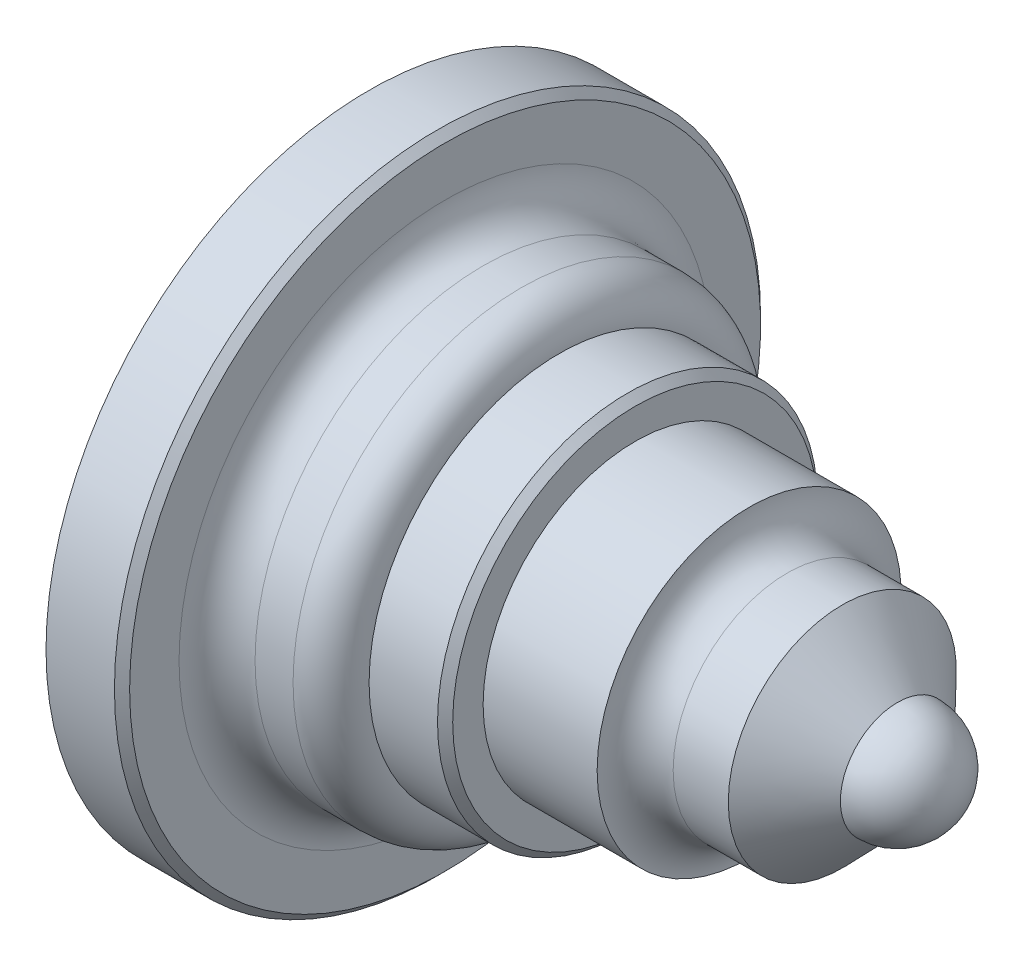
ISO-10303-21;
HEADER;
FILE_DESCRIPTION(('STEP AP214'),'2;1');
FILE_NAME('part.step','',(''),(''),'','','');
FILE_SCHEMA(('AUTOMOTIVE_DESIGN { 1 0 10303 214 1 1 1 1 }'));
ENDSEC;
DATA;
#1=APPLICATION_CONTEXT('core data for automotive mechanical design processes');
#2=APPLICATION_PROTOCOL_DEFINITION('international standard','automotive_design',2000,#1);
#3=PRODUCT_CONTEXT('',#1,'mechanical');
#4=PRODUCT('Part','Part','',(#3));
#5=PRODUCT_RELATED_PRODUCT_CATEGORY('part','',(#4));
#6=PRODUCT_DEFINITION_FORMATION('','',#4);
#7=PRODUCT_DEFINITION_CONTEXT('part definition',#1,'design');
#8=PRODUCT_DEFINITION('design','',#6,#7);
#9=PRODUCT_DEFINITION_SHAPE('','',#8);
#10=(LENGTH_UNIT() NAMED_UNIT(*) SI_UNIT(.MILLI.,.METRE.));
#11=(NAMED_UNIT(*) PLANE_ANGLE_UNIT() SI_UNIT($,.RADIAN.));
#12=(NAMED_UNIT(*) SI_UNIT($,.STERADIAN.) SOLID_ANGLE_UNIT());
#13=UNCERTAINTY_MEASURE_WITH_UNIT(LENGTH_MEASURE(1.E-05),#10,'distance_accuracy_value','');
#14=(GEOMETRIC_REPRESENTATION_CONTEXT(3) GLOBAL_UNCERTAINTY_ASSIGNED_CONTEXT((#13)) GLOBAL_UNIT_ASSIGNED_CONTEXT((#10,
#11,#12)) REPRESENTATION_CONTEXT('',''));
#15=CARTESIAN_POINT('',(0.,0.,0.));
#16=DIRECTION('',(0.,0.,1.));
#17=DIRECTION('',(1.,0.,0.));
#18=AXIS2_PLACEMENT_3D('',#15,#16,#17);
#19=CARTESIAN_POINT('',(0.,0.,0.));
#20=DIRECTION('',(-1.,0.,0.));
#21=DIRECTION('',(0.,0.,1.));
#22=AXIS2_PLACEMENT_3D('',#19,#20,#21);
#23=CYLINDRICAL_SURFACE('',#22,30.);
#24=CARTESIAN_POINT('',(15.,0.,0.));
#25=DIRECTION('',(-1.,0.,0.));
#26=DIRECTION('',(0.,0.,1.));
#27=AXIS2_PLACEMENT_3D('',#24,#25,#26);
#28=CIRCLE('',#27,30.);
#29=CARTESIAN_POINT('',(15.,0.,30.));
#30=VERTEX_POINT('',#29);
#31=EDGE_CURVE('E84',#30,#30,#28,.T.);
#32=ORIENTED_EDGE('',*,*,#31,.F.);
#33=EDGE_LOOP('',(#32));
#34=FACE_BOUND('',#33,.T.);
#35=CARTESIAN_POINT('',(20.,0.,0.));
#36=DIRECTION('',(-1.,0.,0.));
#37=DIRECTION('',(0.,0.,1.));
#38=AXIS2_PLACEMENT_3D('',#35,#36,#37);
#39=CIRCLE('',#38,30.);
#40=CARTESIAN_POINT('',(20.,0.,30.));
#41=VERTEX_POINT('',#40);
#42=EDGE_CURVE('E81',#41,#41,#39,.T.);
#43=ORIENTED_EDGE('',*,*,#42,.T.);
#44=EDGE_LOOP('',(#43));
#45=FACE_BOUND('',#44,.T.);
#46=ADVANCED_FACE('F37',(#34,#45),#23,.T.);
#47=CARTESIAN_POINT('',(15.,0.,0.));
#48=DIRECTION('',(-1.,0.,0.));
#49=DIRECTION('',(0.,0.,1.));
#50=AXIS2_PLACEMENT_3D('',#47,#48,#49);
#51=TOROIDAL_SURFACE('',#50,35.,5.);
#52=ORIENTED_EDGE('',*,*,#31,.T.);
#53=EDGE_LOOP('',(#52));
#54=FACE_BOUND('',#53,.T.);
#55=CARTESIAN_POINT('',(10.,0.,0.));
#56=DIRECTION('',(-1.,0.,0.));
#57=DIRECTION('',(0.,0.,1.));
#58=AXIS2_PLACEMENT_3D('',#55,#56,#57);
#59=CIRCLE('',#58,35.);
#60=CARTESIAN_POINT('',(10.,0.,35.));
#61=VERTEX_POINT('',#60);
#62=EDGE_CURVE('E10',#61,#61,#59,.T.);
#63=ORIENTED_EDGE('',*,*,#62,.F.);
#64=EDGE_LOOP('',(#63));
#65=FACE_BOUND('',#64,.T.);
#66=ADVANCED_FACE('F39',(#54,#65),#51,.F.);
#67=CARTESIAN_POINT('',(20.,0.,0.));
#68=DIRECTION('',(-1.,0.,0.));
#69=DIRECTION('',(0.,0.,1.));
#70=AXIS2_PLACEMENT_3D('',#67,#68,#69);
#71=TOROIDAL_SURFACE('',#70,25.,5.);
#72=ORIENTED_EDGE('',*,*,#42,.F.);
#73=EDGE_LOOP('',(#72));
#74=FACE_BOUND('',#73,.T.);
#75=CARTESIAN_POINT('',(25.,0.,0.));
#76=DIRECTION('',(-1.,0.,0.));
#77=DIRECTION('',(0.,0.,1.));
#78=AXIS2_PLACEMENT_3D('',#75,#76,#77);
#79=CIRCLE('',#78,25.);
#80=CARTESIAN_POINT('',(25.,0.,25.));
#81=VERTEX_POINT('',#80);
#82=EDGE_CURVE('E78',#81,#81,#79,.T.);
#83=ORIENTED_EDGE('',*,*,#82,.T.);
#84=EDGE_LOOP('',(#83));
#85=FACE_BOUND('',#84,.T.);
#86=ADVANCED_FACE('F93',(#74,#85),#71,.T.);
#87=CARTESIAN_POINT('',(0.,0.,0.));
#88=DIRECTION('',(-1.,0.,0.));
#89=DIRECTION('',(0.,0.,1.));
#90=AXIS2_PLACEMENT_3D('',#87,#88,#89);
#91=CYLINDRICAL_SURFACE('',#90,25.);
#92=ORIENTED_EDGE('',*,*,#82,.F.);
#93=EDGE_LOOP('',(#92));
#94=FACE_BOUND('',#93,.T.);
#95=CARTESIAN_POINT('',(34.,0.,0.));
#96=DIRECTION('',(-1.,0.,0.));
#97=DIRECTION('',(0.,0.,1.));
#98=AXIS2_PLACEMENT_3D('',#95,#96,#97);
#99=CIRCLE('',#98,25.);
#100=CARTESIAN_POINT('',(34.,0.,25.));
#101=VERTEX_POINT('',#100);
#102=EDGE_CURVE('E75',#101,#101,#99,.T.);
#103=ORIENTED_EDGE('',*,*,#102,.T.);
#104=EDGE_LOOP('',(#103));
#105=FACE_BOUND('',#104,.T.);
#106=ADVANCED_FACE('F98',(#94,#105),#91,.T.);
#107=CARTESIAN_POINT('',(35.,0.,0.));
#108=DIRECTION('',(-1.,0.,0.));
#109=DIRECTION('',(0.,0.,1.));
#110=AXIS2_PLACEMENT_3D('',#107,#108,#109);
#111=CONICAL_SURFACE('',#110,24.,0.785398163397448);
#112=ORIENTED_EDGE('',*,*,#102,.F.);
#113=EDGE_LOOP('',(#112));
#114=FACE_BOUND('',#113,.T.);
#115=CARTESIAN_POINT('',(35.,0.,0.));
#116=DIRECTION('',(-1.,0.,0.));
#117=DIRECTION('',(0.,0.,1.));
#118=AXIS2_PLACEMENT_3D('',#115,#116,#117);
#119=CIRCLE('',#118,24.);
#120=CARTESIAN_POINT('',(35.,0.,24.));
#121=VERTEX_POINT('',#120);
#122=EDGE_CURVE('E72',#121,#121,#119,.T.);
#123=ORIENTED_EDGE('',*,*,#122,.T.);
#124=EDGE_LOOP('',(#123));
#125=FACE_BOUND('',#124,.T.);
#126=ADVANCED_FACE('F104',(#114,#125),#111,.T.);
#127=CARTESIAN_POINT('',(35.,0.,0.));
#128=DIRECTION('',(-1.,0.,0.));
#129=DIRECTION('',(0.,0.,1.));
#130=AXIS2_PLACEMENT_3D('',#127,#128,#129);
#131=PLANE('',#130);
#132=ORIENTED_EDGE('',*,*,#122,.F.);
#133=EDGE_LOOP('',(#132));
#134=FACE_BOUND('',#133,.T.);
#135=CARTESIAN_POINT('',(35.,0.,0.));
#136=DIRECTION('',(-1.,0.,0.));
#137=DIRECTION('',(0.,0.,1.));
#138=AXIS2_PLACEMENT_3D('',#135,#136,#137);
#139=CIRCLE('',#138,20.);
#140=CARTESIAN_POINT('',(35.,0.,20.));
#141=VERTEX_POINT('',#140);
#142=EDGE_CURVE('E69',#141,#141,#139,.T.);
#143=ORIENTED_EDGE('',*,*,#142,.T.);
#144=EDGE_LOOP('',(#143));
#145=FACE_BOUND('',#144,.T.);
#146=ADVANCED_FACE('F110',(#134,#145),#131,.F.);
#147=CARTESIAN_POINT('',(0.,0.,0.));
#148=DIRECTION('',(-1.,0.,0.));
#149=DIRECTION('',(0.,0.,1.));
#150=AXIS2_PLACEMENT_3D('',#147,#148,#149);
#151=CYLINDRICAL_SURFACE('',#150,20.);
#152=ORIENTED_EDGE('',*,*,#142,.F.);
#153=EDGE_LOOP('',(#152));
#154=FACE_BOUND('',#153,.T.);
#155=CARTESIAN_POINT('',(50.,0.,0.));
#156=DIRECTION('',(-1.,0.,0.));
#157=DIRECTION('',(0.,0.,1.));
#158=AXIS2_PLACEMENT_3D('',#155,#156,#157);
#159=CIRCLE('',#158,20.);
#160=CARTESIAN_POINT('',(50.,0.,20.));
#161=VERTEX_POINT('',#160);
#162=EDGE_CURVE('E66',#161,#161,#159,.T.);
#163=ORIENTED_EDGE('',*,*,#162,.T.);
#164=EDGE_LOOP('',(#163));
#165=FACE_BOUND('',#164,.T.);
#166=ADVANCED_FACE('F116',(#154,#165),#151,.T.);
#167=CARTESIAN_POINT('',(55.,0.,0.));
#168=DIRECTION('',(-1.,0.,0.));
#169=DIRECTION('',(0.,0.,1.));
#170=AXIS2_PLACEMENT_3D('',#167,#168,#169);
#171=TOROIDAL_SURFACE('',#170,20.,5.);
#172=CARTESIAN_POINT('',(55.,0.,0.));
#173=DIRECTION('',(-1.,0.,0.));
#174=DIRECTION('',(0.,0.,1.));
#175=AXIS2_PLACEMENT_3D('',#172,#173,#174);
#176=CIRCLE('',#175,15.);
#177=CARTESIAN_POINT('',(55.,0.,15.));
#178=VERTEX_POINT('',#177);
#179=EDGE_CURVE('E63',#178,#178,#176,.T.);
#180=ORIENTED_EDGE('',*,*,#179,.T.);
#181=EDGE_LOOP('',(#180));
#182=FACE_BOUND('',#181,.T.);
#183=ORIENTED_EDGE('',*,*,#162,.F.);
#184=EDGE_LOOP('',(#183));
#185=FACE_BOUND('',#184,.T.);
#186=ADVANCED_FACE('F122',(#182,#185),#171,.F.);
#187=CARTESIAN_POINT('',(0.,0.,0.));
#188=DIRECTION('',(-1.,0.,0.));
#189=DIRECTION('',(0.,0.,1.));
#190=AXIS2_PLACEMENT_3D('',#187,#188,#189);
#191=CYLINDRICAL_SURFACE('',#190,15.);
#192=ORIENTED_EDGE('',*,*,#179,.F.);
#193=EDGE_LOOP('',(#192));
#194=FACE_BOUND('',#193,.T.);
#195=CARTESIAN_POINT('',(62.25,0.,0.));
#196=DIRECTION('',(-1.,0.,0.));
#197=DIRECTION('',(0.,0.,1.));
#198=AXIS2_PLACEMENT_3D('',#195,#196,#197);
#199=CIRCLE('',#198,15.);
#200=CARTESIAN_POINT('',(62.25,0.,15.));
#201=VERTEX_POINT('',#200);
#202=EDGE_CURVE('E60',#201,#201,#199,.T.);
#203=ORIENTED_EDGE('',*,*,#202,.T.);
#204=EDGE_LOOP('',(#203));
#205=FACE_BOUND('',#204,.T.);
#206=ADVANCED_FACE('F127',(#194,#205),#191,.T.);
#207=CARTESIAN_POINT('',(69.5,0.,0.));
#208=DIRECTION('',(-1.,0.,0.));
#209=DIRECTION('',(0.,0.,1.));
#210=AXIS2_PLACEMENT_3D('',#207,#208,#209);
#211=CONICAL_SURFACE('',#210,7.49999999999999,0.802345693203853);
#212=ORIENTED_EDGE('',*,*,#202,.F.);
#213=EDGE_LOOP('',(#212));
#214=FACE_BOUND('',#213,.T.);
#215=CARTESIAN_POINT('',(69.5,0.,0.));
#216=DIRECTION('',(-1.,0.,0.));
#217=DIRECTION('',(0.,0.,1.));
#218=AXIS2_PLACEMENT_3D('',#215,#216,#217);
#219=CIRCLE('',#218,7.49999999999999);
#220=CARTESIAN_POINT('',(69.5,0.,7.49999999999999));
#221=VERTEX_POINT('',#220);
#222=EDGE_CURVE('E57',#221,#221,#219,.T.);
#223=ORIENTED_EDGE('',*,*,#222,.T.);
#224=EDGE_LOOP('',(#223));
#225=FACE_BOUND('',#224,.T.);
#226=ADVANCED_FACE('F133',(#214,#225),#211,.T.);
#227=CARTESIAN_POINT('',(69.5,0.,0.));
#228=DIRECTION('',(-1.,0.,0.));
#229=DIRECTION('',(0.,1.,0.));
#230=AXIS2_PLACEMENT_3D('',#227,#228,#229);
#231=SPHERICAL_SURFACE('',#230,7.5);
#232=ORIENTED_EDGE('',*,*,#222,.F.);
#233=EDGE_LOOP('',(#232));
#234=FACE_BOUND('',#233,.T.);
#235=ADVANCED_FACE('F149',(#234),#231,.T.);
#236=CARTESIAN_POINT('',(0.,0.,0.));
#237=DIRECTION('',(-1.,0.,0.));
#238=DIRECTION('',(0.,0.,1.));
#239=AXIS2_PLACEMENT_3D('',#236,#237,#238);
#240=CYLINDRICAL_SURFACE('',#239,42.5);
#241=CARTESIAN_POINT('',(9.00000000000001,0.,0.));
#242=DIRECTION('',(-1.,0.,0.));
#243=DIRECTION('',(0.,0.,1.));
#244=AXIS2_PLACEMENT_3D('',#241,#242,#243);
#245=CIRCLE('',#244,42.5);
#246=CARTESIAN_POINT('',(9.00000000000001,0.,42.5));
#247=VERTEX_POINT('',#246);
#248=EDGE_CURVE('E48',#247,#247,#245,.T.);
#249=ORIENTED_EDGE('',*,*,#248,.T.);
#250=EDGE_LOOP('',(#249));
#251=FACE_BOUND('',#250,.T.);
#252=CARTESIAN_POINT('',(0.,0.,0.));
#253=DIRECTION('',(-1.,0.,0.));
#254=DIRECTION('',(0.,0.,1.));
#255=AXIS2_PLACEMENT_3D('',#252,#253,#254);
#256=CIRCLE('',#255,42.5);
#257=CARTESIAN_POINT('',(0.,0.,42.5));
#258=VERTEX_POINT('',#257);
#259=EDGE_CURVE('E52',#258,#258,#256,.T.);
#260=ORIENTED_EDGE('',*,*,#259,.F.);
#261=EDGE_LOOP('',(#260));
#262=FACE_BOUND('',#261,.T.);
#263=ADVANCED_FACE('F139',(#251,#262),#240,.T.);
#264=CARTESIAN_POINT('',(0.,0.,0.));
#265=DIRECTION('',(-1.,0.,0.));
#266=DIRECTION('',(0.,0.,1.));
#267=AXIS2_PLACEMENT_3D('',#264,#265,#266);
#268=PLANE('',#267);
#269=ORIENTED_EDGE('',*,*,#259,.T.);
#270=EDGE_LOOP('',(#269));
#271=FACE_BOUND('',#270,.T.);
#272=ADVANCED_FACE('F136',(#271),#268,.T.);
#273=CARTESIAN_POINT('',(10.,0.,0.));
#274=DIRECTION('',(-1.,0.,0.));
#275=DIRECTION('',(0.,0.,1.));
#276=AXIS2_PLACEMENT_3D('',#273,#274,#275);
#277=CONICAL_SURFACE('',#276,41.5,0.78539816339746);
#278=ORIENTED_EDGE('',*,*,#248,.F.);
#279=EDGE_LOOP('',(#278));
#280=FACE_BOUND('',#279,.T.);
#281=CARTESIAN_POINT('',(10.,0.,0.));
#282=DIRECTION('',(-1.,0.,0.));
#283=DIRECTION('',(0.,0.,1.));
#284=AXIS2_PLACEMENT_3D('',#281,#282,#283);
#285=CIRCLE('',#284,41.5);
#286=CARTESIAN_POINT('',(10.,0.,41.5));
#287=VERTEX_POINT('',#286);
#288=EDGE_CURVE('E44',#287,#287,#285,.T.);
#289=ORIENTED_EDGE('',*,*,#288,.T.);
#290=EDGE_LOOP('',(#289));
#291=FACE_BOUND('',#290,.T.);
#292=ADVANCED_FACE('F138',(#280,#291),#277,.T.);
#293=CARTESIAN_POINT('',(10.,0.,0.));
#294=DIRECTION('',(-1.,0.,0.));
#295=DIRECTION('',(0.,0.,1.));
#296=AXIS2_PLACEMENT_3D('',#293,#294,#295);
#297=PLANE('',#296);
#298=ORIENTED_EDGE('',*,*,#288,.F.);
#299=EDGE_LOOP('',(#298));
#300=FACE_BOUND('',#299,.T.);
#301=ORIENTED_EDGE('',*,*,#62,.T.);
#302=EDGE_LOOP('',(#301));
#303=FACE_BOUND('',#302,.T.);
#304=ADVANCED_FACE('F146',(#300,#303),#297,.F.);
#305=CLOSED_SHELL('',(#46,#66,#86,#106,#126,#146,#166,#186,#206,#226,#235,#263,#272,#292,#304));
#306=MANIFOLD_SOLID_BREP('B2',#305);
#307=ADVANCED_BREP_SHAPE_REPRESENTATION('',(#18,#306),#14);
#308=SHAPE_DEFINITION_REPRESENTATION(#9,#307);
ENDSEC;
END-ISO-10303-21;
